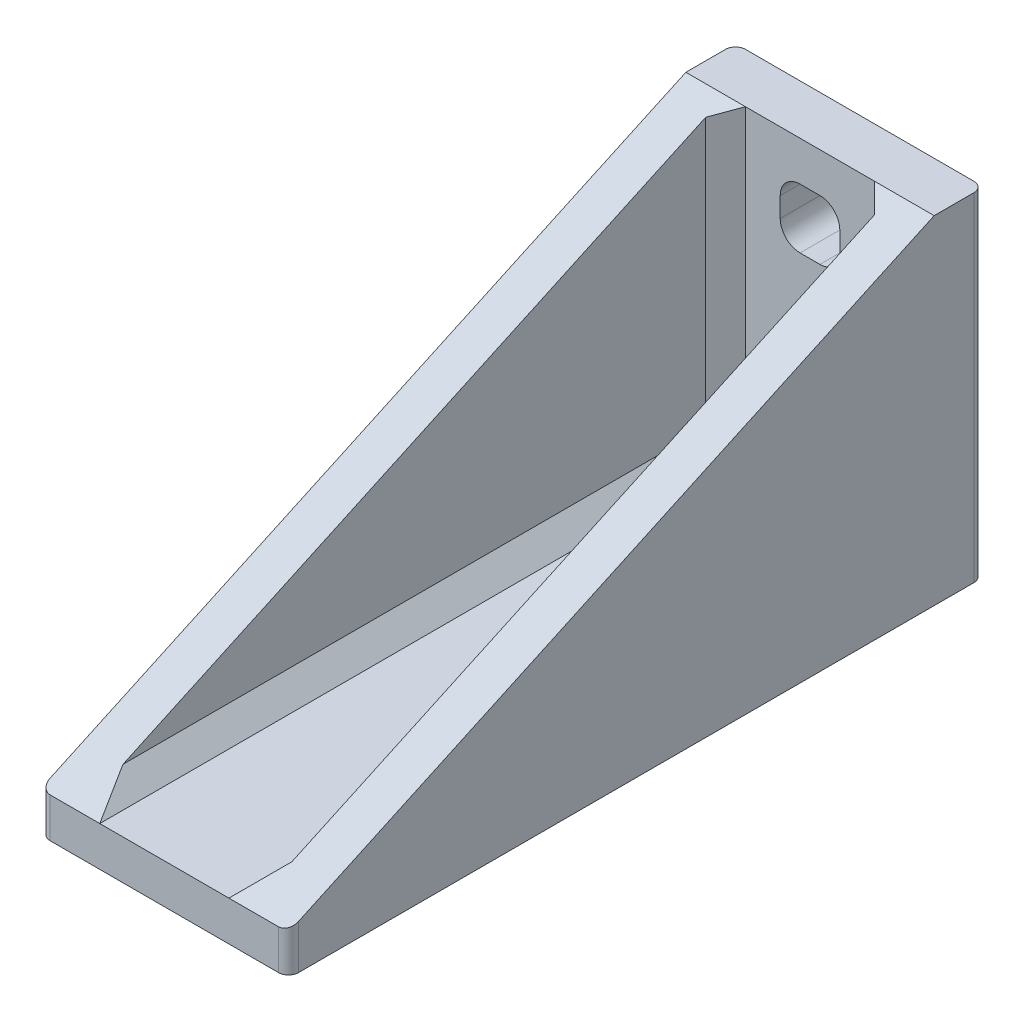
ISO-10303-21;
HEADER;
FILE_DESCRIPTION(('STEP AP214'),'2;1');
FILE_NAME('part.step','',(''),(''),'','','');
FILE_SCHEMA(('AUTOMOTIVE_DESIGN { 1 0 10303 214 1 1 1 1 }'));
ENDSEC;
DATA;
#1=APPLICATION_CONTEXT('core data for automotive mechanical design processes');
#2=APPLICATION_PROTOCOL_DEFINITION('international standard','automotive_design',2000,#1);
#3=PRODUCT_CONTEXT('',#1,'mechanical');
#4=PRODUCT('Part','Part','',(#3));
#5=PRODUCT_RELATED_PRODUCT_CATEGORY('part','',(#4));
#6=PRODUCT_DEFINITION_FORMATION('','',#4);
#7=PRODUCT_DEFINITION_CONTEXT('part definition',#1,'design');
#8=PRODUCT_DEFINITION('design','',#6,#7);
#9=PRODUCT_DEFINITION_SHAPE('','',#8);
#10=(LENGTH_UNIT() NAMED_UNIT(*) SI_UNIT(.MILLI.,.METRE.));
#11=(NAMED_UNIT(*) PLANE_ANGLE_UNIT() SI_UNIT($,.RADIAN.));
#12=(NAMED_UNIT(*) SI_UNIT($,.STERADIAN.) SOLID_ANGLE_UNIT());
#13=UNCERTAINTY_MEASURE_WITH_UNIT(LENGTH_MEASURE(1.E-05),#10,'distance_accuracy_value','');
#14=(GEOMETRIC_REPRESENTATION_CONTEXT(3) GLOBAL_UNCERTAINTY_ASSIGNED_CONTEXT((#13)) GLOBAL_UNIT_ASSIGNED_CONTEXT((#10,
#11,#12)) REPRESENTATION_CONTEXT('',''));
#15=CARTESIAN_POINT('',(0.,0.,0.));
#16=DIRECTION('',(0.,0.,1.));
#17=DIRECTION('',(1.,0.,0.));
#18=AXIS2_PLACEMENT_3D('',#15,#16,#17);
#19=CARTESIAN_POINT('',(-11.5,4.,34.));
#20=DIRECTION('',(0.,1.,0.));
#21=DIRECTION('',(0.,0.,1.));
#22=AXIS2_PLACEMENT_3D('',#19,#20,#21);
#23=CYLINDRICAL_SURFACE('',#22,1.);
#24=DIRECTION('',(0.,1.,0.));
#25=VECTOR('',#24,1.);
#26=CARTESIAN_POINT('',(-12.5,4.,34.));
#27=LINE('',#26,#25);
#28=CARTESIAN_POINT('',(-12.5,0.,34.));
#29=VERTEX_POINT('',#28);
#30=CARTESIAN_POINT('',(-12.5,4.46153846153823,34.));
#31=VERTEX_POINT('',#30);
#32=EDGE_CURVE('E496',#29,#31,#27,.T.);
#33=ORIENTED_EDGE('',*,*,#32,.F.);
#34=CARTESIAN_POINT('',(-11.5,0.,34.));
#35=DIRECTION('',(0.,1.,0.));
#36=DIRECTION('',(0.,0.,1.));
#37=AXIS2_PLACEMENT_3D('',#34,#35,#36);
#38=CIRCLE('',#37,1.);
#39=CARTESIAN_POINT('',(-11.5,0.,35.));
#40=VERTEX_POINT('',#39);
#41=EDGE_CURVE('E41',#40,#29,#38,.F.);
#42=ORIENTED_EDGE('',*,*,#41,.F.);
#43=DIRECTION('',(0.,1.,0.));
#44=VECTOR('',#43,1.);
#45=CARTESIAN_POINT('',(-11.5,4.,35.));
#46=LINE('',#45,#44);
#47=CARTESIAN_POINT('',(-11.5,4.,35.));
#48=VERTEX_POINT('',#47);
#49=EDGE_CURVE('E499',#48,#40,#46,.F.);
#50=ORIENTED_EDGE('',*,*,#49,.F.);
#51=CARTESIAN_POINT('',(-11.5,4.46153846153824,34.));
#52=DIRECTION('',(0.,-0.907959384500451,-0.419058177461749));
#53=DIRECTION('',(0.,0.419058177461749,-0.907959384500451));
#54=AXIS2_PLACEMENT_3D('',#51,#52,#53);
#55=ELLIPSE('',#54,1.10137085102126,1.);
#56=EDGE_CURVE('E11',#31,#48,#55,.F.);
#57=ORIENTED_EDGE('',*,*,#56,.F.);
#58=EDGE_LOOP('',(#33,#42,#50,#57));
#59=FACE_BOUND('',#58,.T.);
#60=ADVANCED_FACE('F34',(#59),#23,.T.);
#61=CARTESIAN_POINT('',(11.5,4.,34.));
#62=DIRECTION('',(0.,1.,0.));
#63=DIRECTION('',(0.,0.,1.));
#64=AXIS2_PLACEMENT_3D('',#61,#62,#63);
#65=CYLINDRICAL_SURFACE('',#64,1.);
#66=DIRECTION('',(0.,1.,0.));
#67=VECTOR('',#66,1.);
#68=CARTESIAN_POINT('',(11.5,4.,35.));
#69=LINE('',#68,#67);
#70=CARTESIAN_POINT('',(11.5,0.,35.));
#71=VERTEX_POINT('',#70);
#72=CARTESIAN_POINT('',(11.5,4.,35.));
#73=VERTEX_POINT('',#72);
#74=EDGE_CURVE('E485',#71,#73,#69,.T.);
#75=ORIENTED_EDGE('',*,*,#74,.F.);
#76=CARTESIAN_POINT('',(11.5,0.,34.));
#77=DIRECTION('',(0.,1.,0.));
#78=DIRECTION('',(0.,0.,1.));
#79=AXIS2_PLACEMENT_3D('',#76,#77,#78);
#80=CIRCLE('',#79,1.);
#81=CARTESIAN_POINT('',(12.5,0.,34.));
#82=VERTEX_POINT('',#81);
#83=EDGE_CURVE('E491',#82,#71,#80,.F.);
#84=ORIENTED_EDGE('',*,*,#83,.F.);
#85=DIRECTION('',(0.,1.,0.));
#86=VECTOR('',#85,1.);
#87=CARTESIAN_POINT('',(12.5,4.,34.));
#88=LINE('',#87,#86);
#89=CARTESIAN_POINT('',(12.5,4.46153846153823,34.));
#90=VERTEX_POINT('',#89);
#91=EDGE_CURVE('E488',#90,#82,#88,.F.);
#92=ORIENTED_EDGE('',*,*,#91,.F.);
#93=CARTESIAN_POINT('',(11.5,4.46153846153824,34.));
#94=DIRECTION('',(0.,-0.907959384500451,-0.419058177461749));
#95=DIRECTION('',(0.,0.419058177461749,-0.907959384500451));
#96=AXIS2_PLACEMENT_3D('',#93,#94,#95);
#97=ELLIPSE('',#96,1.10137085102126,1.);
#98=EDGE_CURVE('E494',#73,#90,#97,.F.);
#99=ORIENTED_EDGE('',*,*,#98,.F.);
#100=EDGE_LOOP('',(#75,#84,#92,#99));
#101=FACE_BOUND('',#100,.T.);
#102=ADVANCED_FACE('F533',(#101),#65,.T.);
#103=CARTESIAN_POINT('',(-11.5,4.,-34.));
#104=DIRECTION('',(0.,1.,0.));
#105=DIRECTION('',(0.,0.,1.));
#106=AXIS2_PLACEMENT_3D('',#103,#104,#105);
#107=CYLINDRICAL_SURFACE('',#106,1.);
#108=DIRECTION('',(0.,1.,0.));
#109=VECTOR('',#108,1.);
#110=CARTESIAN_POINT('',(-11.5,4.,-35.));
#111=LINE('',#110,#109);
#112=CARTESIAN_POINT('',(-11.5,0.,-35.));
#113=VERTEX_POINT('',#112);
#114=CARTESIAN_POINT('',(-11.5,34.,-35.));
#115=VERTEX_POINT('',#114);
#116=EDGE_CURVE('E475',#113,#115,#111,.T.);
#117=ORIENTED_EDGE('',*,*,#116,.F.);
#118=CARTESIAN_POINT('',(-11.5,0.,-34.));
#119=DIRECTION('',(0.,1.,0.));
#120=DIRECTION('',(0.,0.,1.));
#121=AXIS2_PLACEMENT_3D('',#118,#119,#120);
#122=CIRCLE('',#121,1.);
#123=CARTESIAN_POINT('',(-12.5,0.,-34.));
#124=VERTEX_POINT('',#123);
#125=EDGE_CURVE('E481',#124,#113,#122,.F.);
#126=ORIENTED_EDGE('',*,*,#125,.F.);
#127=DIRECTION('',(0.,1.,0.));
#128=VECTOR('',#127,1.);
#129=CARTESIAN_POINT('',(-12.5,4.,-34.));
#130=LINE('',#129,#128);
#131=CARTESIAN_POINT('',(-12.5,34.,-34.));
#132=VERTEX_POINT('',#131);
#133=EDGE_CURVE('E478',#132,#124,#130,.F.);
#134=ORIENTED_EDGE('',*,*,#133,.F.);
#135=CARTESIAN_POINT('',(-11.5,34.,-34.));
#136=DIRECTION('',(0.,1.,0.));
#137=DIRECTION('',(0.,0.,1.));
#138=AXIS2_PLACEMENT_3D('',#135,#136,#137);
#139=CIRCLE('',#138,1.);
#140=EDGE_CURVE('E483',#115,#132,#139,.T.);
#141=ORIENTED_EDGE('',*,*,#140,.F.);
#142=EDGE_LOOP('',(#117,#126,#134,#141));
#143=FACE_BOUND('',#142,.T.);
#144=ADVANCED_FACE('F510',(#143),#107,.T.);
#145=CARTESIAN_POINT('',(11.5,4.,-34.));
#146=DIRECTION('',(0.,-1.,0.));
#147=DIRECTION('',(0.,0.,-1.));
#148=AXIS2_PLACEMENT_3D('',#145,#146,#147);
#149=CYLINDRICAL_SURFACE('',#148,1.);
#150=DIRECTION('',(0.,-1.,0.));
#151=VECTOR('',#150,1.);
#152=CARTESIAN_POINT('',(11.5,4.,-35.));
#153=LINE('',#152,#151);
#154=CARTESIAN_POINT('',(11.5,34.,-35.));
#155=VERTEX_POINT('',#154);
#156=CARTESIAN_POINT('',(11.5,0.,-35.));
#157=VERTEX_POINT('',#156);
#158=EDGE_CURVE('E464',#155,#157,#153,.T.);
#159=ORIENTED_EDGE('',*,*,#158,.F.);
#160=CARTESIAN_POINT('',(11.5,34.,-34.));
#161=DIRECTION('',(0.,1.,0.));
#162=DIRECTION('',(0.,0.,1.));
#163=AXIS2_PLACEMENT_3D('',#160,#161,#162);
#164=CIRCLE('',#163,1.);
#165=CARTESIAN_POINT('',(12.5,34.,-34.));
#166=VERTEX_POINT('',#165);
#167=EDGE_CURVE('E470',#166,#155,#164,.T.);
#168=ORIENTED_EDGE('',*,*,#167,.F.);
#169=DIRECTION('',(0.,-1.,0.));
#170=VECTOR('',#169,1.);
#171=CARTESIAN_POINT('',(12.5,4.,-34.));
#172=LINE('',#171,#170);
#173=CARTESIAN_POINT('',(12.5,0.,-34.));
#174=VERTEX_POINT('',#173);
#175=EDGE_CURVE('E467',#174,#166,#172,.F.);
#176=ORIENTED_EDGE('',*,*,#175,.F.);
#177=CARTESIAN_POINT('',(11.5,0.,-34.));
#178=DIRECTION('',(0.,1.,0.));
#179=DIRECTION('',(0.,0.,1.));
#180=AXIS2_PLACEMENT_3D('',#177,#178,#179);
#181=CIRCLE('',#180,1.);
#182=EDGE_CURVE('E472',#157,#174,#181,.F.);
#183=ORIENTED_EDGE('',*,*,#182,.F.);
#184=EDGE_LOOP('',(#159,#168,#176,#183));
#185=FACE_BOUND('',#184,.T.);
#186=ADVANCED_FACE('F518',(#185),#149,.T.);
#187=CARTESIAN_POINT('',(-12.5,34.,-30.));
#188=DIRECTION('',(0.,-0.907959384500451,-0.419058177461749));
#189=DIRECTION('',(1.,0.,0.));
#190=AXIS2_PLACEMENT_3D('',#187,#188,#189);
#191=PLANE('',#190);
#192=DIRECTION('',(1.,0.,0.));
#193=VECTOR('',#192,1.);
#194=CARTESIAN_POINT('',(-12.5,4.,35.));
#195=LINE('',#194,#193);
#196=CARTESIAN_POINT('',(6.50000000000001,4.,35.));
#197=VERTEX_POINT('',#196);
#198=EDGE_CURVE('E363',#197,#73,#195,.T.);
#199=ORIENTED_EDGE('',*,*,#198,.T.);
#200=ORIENTED_EDGE('',*,*,#98,.T.);
#201=DIRECTION('',(0.,-0.419058177461749,0.907959384500451));
#202=VECTOR('',#201,1.);
#203=CARTESIAN_POINT('',(12.5,30.6341463414633,-22.7073170731707));
#204=LINE('',#203,#202);
#205=CARTESIAN_POINT('',(12.5,34.,-30.));
#206=VERTEX_POINT('',#205);
#207=EDGE_CURVE('E362',#206,#90,#204,.T.);
#208=ORIENTED_EDGE('',*,*,#207,.F.);
#209=DIRECTION('',(1.,0.,0.));
#210=VECTOR('',#209,1.);
#211=CARTESIAN_POINT('',(-12.5,34.,-30.));
#212=LINE('',#211,#210);
#213=CARTESIAN_POINT('',(6.49999999999998,34.,-30.));
#214=VERTEX_POINT('',#213);
#215=EDGE_CURVE('E349',#214,#206,#212,.T.);
#216=ORIENTED_EDGE('',*,*,#215,.F.);
#217=DIRECTION('',(0.672213996993528,-0.310252613997012,0.672213996993522));
#218=VECTOR('',#217,1.);
#219=CARTESIAN_POINT('',(-2.0855614973263,37.9625668449197,-38.5855614973262));
#220=LINE('',#219,#218);
#221=CARTESIAN_POINT('',(8.50000000000001,33.076923076923,-28.));
#222=VERTEX_POINT('',#221);
#223=EDGE_CURVE('E430',#214,#222,#220,.T.);
#224=ORIENTED_EDGE('',*,*,#223,.T.);
#225=DIRECTION('',(0.,-0.419058177461749,0.907959384500451));
#226=VECTOR('',#225,1.);
#227=CARTESIAN_POINT('',(8.50000000000001,34.,-30.));
#228=LINE('',#227,#226);
#229=CARTESIAN_POINT('',(8.50000000000001,6.00000000000001,30.6666666666662));
#230=VERTEX_POINT('',#229);
#231=EDGE_CURVE('E380',#222,#230,#228,.T.);
#232=ORIENTED_EDGE('',*,*,#231,.T.);
#233=DIRECTION('',(0.386493975840497,0.386493975840501,-0.83740361432108));
#234=VECTOR('',#233,1.);
#235=CARTESIAN_POINT('',(29.180497925311,26.6804979253112,-14.1410788381745));
#236=LINE('',#235,#234);
#237=EDGE_CURVE('E396',#230,#197,#236,.F.);
#238=ORIENTED_EDGE('',*,*,#237,.T.);
#239=EDGE_LOOP('',(#199,#200,#208,#216,#224,#232,#238));
#240=FACE_BOUND('',#239,.T.);
#241=ADVANCED_FACE('F529',(#240),#191,.F.);
#242=CARTESIAN_POINT('',(12.5,4.,-35.));
#243=DIRECTION('',(-1.,0.,0.));
#244=DIRECTION('',(0.,0.,1.));
#245=AXIS2_PLACEMENT_3D('',#242,#243,#244);
#246=PLANE('',#245);
#247=ORIENTED_EDGE('',*,*,#207,.T.);
#248=ORIENTED_EDGE('',*,*,#91,.T.);
#249=DIRECTION('',(0.,0.,-1.));
#250=VECTOR('',#249,1.);
#251=CARTESIAN_POINT('',(12.5,0.,-35.));
#252=LINE('',#251,#250);
#253=EDGE_CURVE('E359',#82,#174,#252,.T.);
#254=ORIENTED_EDGE('',*,*,#253,.T.);
#255=ORIENTED_EDGE('',*,*,#175,.T.);
#256=DIRECTION('',(0.,0.,-1.));
#257=VECTOR('',#256,1.);
#258=CARTESIAN_POINT('',(12.5,34.,-35.));
#259=LINE('',#258,#257);
#260=EDGE_CURVE('E353',#206,#166,#259,.T.);
#261=ORIENTED_EDGE('',*,*,#260,.F.);
#262=EDGE_LOOP('',(#247,#248,#254,#255,#261));
#263=FACE_BOUND('',#262,.T.);
#264=ADVANCED_FACE('F521',(#263),#246,.F.);
#265=CARTESIAN_POINT('',(-12.5,4.,-35.));
#266=DIRECTION('',(0.,0.,1.));
#267=DIRECTION('',(1.,0.,0.));
#268=AXIS2_PLACEMENT_3D('',#265,#266,#267);
#269=PLANE('',#268);
#270=DIRECTION('',(-1.,0.,0.));
#271=VECTOR('',#270,1.);
#272=CARTESIAN_POINT('',(0.999999999999995,24.,-35.));
#273=LINE('',#272,#271);
#274=CARTESIAN_POINT('',(0.999999999999996,24.,-35.));
#275=VERTEX_POINT('',#274);
#276=CARTESIAN_POINT('',(-1.00000000000001,24.,-35.));
#277=VERTEX_POINT('',#276);
#278=EDGE_CURVE('E261',#275,#277,#273,.T.);
#279=ORIENTED_EDGE('',*,*,#278,.F.);
#280=CARTESIAN_POINT('',(0.999999999999995,26.,-35.));
#281=DIRECTION('',(0.,0.,-1.));
#282=DIRECTION('',(1.,0.,0.));
#283=AXIS2_PLACEMENT_3D('',#280,#281,#282);
#284=CIRCLE('',#283,2.);
#285=CARTESIAN_POINT('',(2.99999999999999,26.,-35.));
#286=VERTEX_POINT('',#285);
#287=EDGE_CURVE('E266',#286,#275,#284,.T.);
#288=ORIENTED_EDGE('',*,*,#287,.F.);
#289=DIRECTION('',(0.,-1.,0.));
#290=VECTOR('',#289,1.);
#291=CARTESIAN_POINT('',(2.99999999999999,26.,-35.));
#292=LINE('',#291,#290);
#293=CARTESIAN_POINT('',(3.,28.,-35.));
#294=VERTEX_POINT('',#293);
#295=EDGE_CURVE('E286',#294,#286,#292,.T.);
#296=ORIENTED_EDGE('',*,*,#295,.F.);
#297=CARTESIAN_POINT('',(0.999999999999995,28.,-35.));
#298=DIRECTION('',(0.,0.,-1.));
#299=DIRECTION('',(-1.,0.,0.));
#300=AXIS2_PLACEMENT_3D('',#297,#298,#299);
#301=CIRCLE('',#300,2.);
#302=CARTESIAN_POINT('',(0.999999999999995,30.,-35.));
#303=VERTEX_POINT('',#302);
#304=EDGE_CURVE('E283',#303,#294,#301,.T.);
#305=ORIENTED_EDGE('',*,*,#304,.F.);
#306=DIRECTION('',(1.,0.,0.));
#307=VECTOR('',#306,1.);
#308=CARTESIAN_POINT('',(0.999999999999995,30.,-35.));
#309=LINE('',#308,#307);
#310=CARTESIAN_POINT('',(-1.00000000000001,30.,-35.));
#311=VERTEX_POINT('',#310);
#312=EDGE_CURVE('E280',#311,#303,#309,.T.);
#313=ORIENTED_EDGE('',*,*,#312,.F.);
#314=CARTESIAN_POINT('',(-1.00000000000001,28.,-35.));
#315=DIRECTION('',(0.,0.,-1.));
#316=DIRECTION('',(1.,0.,0.));
#317=AXIS2_PLACEMENT_3D('',#314,#315,#316);
#318=CIRCLE('',#317,2.);
#319=CARTESIAN_POINT('',(-3.,28.,-35.));
#320=VERTEX_POINT('',#319);
#321=EDGE_CURVE('E274',#320,#311,#318,.T.);
#322=ORIENTED_EDGE('',*,*,#321,.F.);
#323=DIRECTION('',(0.,1.,0.));
#324=VECTOR('',#323,1.);
#325=CARTESIAN_POINT('',(-3.00000000000001,26.,-35.));
#326=LINE('',#325,#324);
#327=CARTESIAN_POINT('',(-3.00000000000001,26.,-35.));
#328=VERTEX_POINT('',#327);
#329=EDGE_CURVE('E272',#328,#320,#326,.T.);
#330=ORIENTED_EDGE('',*,*,#329,.F.);
#331=CARTESIAN_POINT('',(-1.,26.,-35.));
#332=DIRECTION('',(0.,0.,-1.));
#333=DIRECTION('',(1.,0.,0.));
#334=AXIS2_PLACEMENT_3D('',#331,#332,#333);
#335=CIRCLE('',#334,2.);
#336=EDGE_CURVE('E250',#277,#328,#335,.T.);
#337=ORIENTED_EDGE('',*,*,#336,.F.);
#338=EDGE_LOOP('',(#279,#288,#296,#305,#313,#322,#330,#337));
#339=FACE_BOUND('',#338,.T.);
#340=DIRECTION('',(-1.,0.,0.));
#341=VECTOR('',#340,1.);
#342=CARTESIAN_POINT('',(0.999999999999995,10.,-35.));
#343=LINE('',#342,#341);
#344=CARTESIAN_POINT('',(0.999999999999996,10.,-35.));
#345=VERTEX_POINT('',#344);
#346=CARTESIAN_POINT('',(-1.00000000000001,10.,-35.));
#347=VERTEX_POINT('',#346);
#348=EDGE_CURVE('E303',#345,#347,#343,.T.);
#349=ORIENTED_EDGE('',*,*,#348,.F.);
#350=CARTESIAN_POINT('',(0.999999999999995,12.,-35.));
#351=DIRECTION('',(0.,0.,-1.));
#352=DIRECTION('',(1.,0.,0.));
#353=AXIS2_PLACEMENT_3D('',#350,#351,#352);
#354=CIRCLE('',#353,2.);
#355=CARTESIAN_POINT('',(3.,12.,-35.));
#356=VERTEX_POINT('',#355);
#357=EDGE_CURVE('E291',#356,#345,#354,.T.);
#358=ORIENTED_EDGE('',*,*,#357,.F.);
#359=DIRECTION('',(0.,-1.,0.));
#360=VECTOR('',#359,1.);
#361=CARTESIAN_POINT('',(2.99999999999999,14.,-35.));
#362=LINE('',#361,#360);
#363=CARTESIAN_POINT('',(3.,14.,-35.));
#364=VERTEX_POINT('',#363);
#365=EDGE_CURVE('E321',#364,#356,#362,.T.);
#366=ORIENTED_EDGE('',*,*,#365,.F.);
#367=CARTESIAN_POINT('',(0.999999999999995,14.,-35.));
#368=DIRECTION('',(0.,0.,-1.));
#369=DIRECTION('',(-1.,0.,0.));
#370=AXIS2_PLACEMENT_3D('',#367,#368,#369);
#371=CIRCLE('',#370,2.);
#372=CARTESIAN_POINT('',(0.999999999999995,16.,-35.));
#373=VERTEX_POINT('',#372);
#374=EDGE_CURVE('E318',#373,#364,#371,.T.);
#375=ORIENTED_EDGE('',*,*,#374,.F.);
#376=DIRECTION('',(1.,0.,0.));
#377=VECTOR('',#376,1.);
#378=CARTESIAN_POINT('',(0.999999999999995,16.,-35.));
#379=LINE('',#378,#377);
#380=CARTESIAN_POINT('',(-1.00000000000001,16.,-35.));
#381=VERTEX_POINT('',#380);
#382=EDGE_CURVE('E315',#381,#373,#379,.T.);
#383=ORIENTED_EDGE('',*,*,#382,.F.);
#384=CARTESIAN_POINT('',(-1.,14.,-35.));
#385=DIRECTION('',(0.,0.,-1.));
#386=DIRECTION('',(-1.,0.,0.));
#387=AXIS2_PLACEMENT_3D('',#384,#385,#386);
#388=CIRCLE('',#387,2.);
#389=CARTESIAN_POINT('',(-3.00000000000001,14.,-35.));
#390=VERTEX_POINT('',#389);
#391=EDGE_CURVE('E312',#390,#381,#388,.T.);
#392=ORIENTED_EDGE('',*,*,#391,.F.);
#393=DIRECTION('',(0.,1.,0.));
#394=VECTOR('',#393,1.);
#395=CARTESIAN_POINT('',(-3.00000000000001,14.,-35.));
#396=LINE('',#395,#394);
#397=CARTESIAN_POINT('',(-3.,12.,-35.));
#398=VERTEX_POINT('',#397);
#399=EDGE_CURVE('E309',#398,#390,#396,.T.);
#400=ORIENTED_EDGE('',*,*,#399,.F.);
#401=CARTESIAN_POINT('',(-1.00000000000001,12.,-35.));
#402=DIRECTION('',(0.,0.,-1.));
#403=DIRECTION('',(-1.,0.,0.));
#404=AXIS2_PLACEMENT_3D('',#401,#402,#403);
#405=CIRCLE('',#404,2.);
#406=EDGE_CURVE('E306',#347,#398,#405,.T.);
#407=ORIENTED_EDGE('',*,*,#406,.F.);
#408=EDGE_LOOP('',(#349,#358,#366,#375,#383,#392,#400,#407));
#409=FACE_BOUND('',#408,.T.);
#410=DIRECTION('',(-1.,0.,0.));
#411=VECTOR('',#410,1.);
#412=CARTESIAN_POINT('',(-12.5,0.,-35.));
#413=LINE('',#412,#411);
#414=EDGE_CURVE('E365',#157,#113,#413,.T.);
#415=ORIENTED_EDGE('',*,*,#414,.T.);
#416=ORIENTED_EDGE('',*,*,#116,.T.);
#417=DIRECTION('',(-1.,0.,0.));
#418=VECTOR('',#417,1.);
#419=CARTESIAN_POINT('',(-12.5,34.,-35.));
#420=LINE('',#419,#418);
#421=EDGE_CURVE('E356',#155,#115,#420,.T.);
#422=ORIENTED_EDGE('',*,*,#421,.F.);
#423=ORIENTED_EDGE('',*,*,#158,.T.);
#424=EDGE_LOOP('',(#415,#416,#422,#423));
#425=FACE_BOUND('',#424,.T.);
#426=ADVANCED_FACE('F268',(#339,#409,#425),#269,.F.);
#427=CARTESIAN_POINT('',(-12.5,4.,-35.));
#428=DIRECTION('',(1.,0.,0.));
#429=DIRECTION('',(0.,0.,-1.));
#430=AXIS2_PLACEMENT_3D('',#427,#428,#429);
#431=PLANE('',#430);
#432=DIRECTION('',(0.,0.,1.));
#433=VECTOR('',#432,1.);
#434=CARTESIAN_POINT('',(-12.5,0.,-35.));
#435=LINE('',#434,#433);
#436=EDGE_CURVE('E368',#124,#29,#435,.T.);
#437=ORIENTED_EDGE('',*,*,#436,.T.);
#438=ORIENTED_EDGE('',*,*,#32,.T.);
#439=DIRECTION('',(0.,0.419058177461749,-0.907959384500451));
#440=VECTOR('',#439,1.);
#441=CARTESIAN_POINT('',(-12.5,30.6341463414633,-22.7073170731707));
#442=LINE('',#441,#440);
#443=CARTESIAN_POINT('',(-12.5,34.,-30.));
#444=VERTEX_POINT('',#443);
#445=EDGE_CURVE('E375',#31,#444,#442,.T.);
#446=ORIENTED_EDGE('',*,*,#445,.T.);
#447=DIRECTION('',(0.,0.,1.));
#448=VECTOR('',#447,1.);
#449=CARTESIAN_POINT('',(-12.5,34.,-35.));
#450=LINE('',#449,#448);
#451=EDGE_CURVE('E344',#132,#444,#450,.T.);
#452=ORIENTED_EDGE('',*,*,#451,.F.);
#453=ORIENTED_EDGE('',*,*,#133,.T.);
#454=EDGE_LOOP('',(#437,#438,#446,#452,#453));
#455=FACE_BOUND('',#454,.T.);
#456=ADVANCED_FACE('F505',(#455),#431,.F.);
#457=CARTESIAN_POINT('',(-12.5,4.,35.));
#458=DIRECTION('',(0.,0.,-1.));
#459=DIRECTION('',(-1.,0.,0.));
#460=AXIS2_PLACEMENT_3D('',#457,#458,#459);
#461=PLANE('',#460);
#462=CARTESIAN_POINT('',(-6.49999999999999,4.,35.));
#463=VERTEX_POINT('',#462);
#464=EDGE_CURVE('E360',#48,#463,#195,.T.);
#465=ORIENTED_EDGE('',*,*,#464,.F.);
#466=ORIENTED_EDGE('',*,*,#49,.T.);
#467=DIRECTION('',(1.,0.,0.));
#468=VECTOR('',#467,1.);
#469=CARTESIAN_POINT('',(-12.5,0.,35.));
#470=LINE('',#469,#468);
#471=EDGE_CURVE('E371',#40,#71,#470,.T.);
#472=ORIENTED_EDGE('',*,*,#471,.T.);
#473=ORIENTED_EDGE('',*,*,#74,.T.);
#474=ORIENTED_EDGE('',*,*,#198,.F.);
#475=DIRECTION('',(1.,0.,0.));
#476=VECTOR('',#475,1.);
#477=CARTESIAN_POINT('',(-8.49999999999999,4.,35.));
#478=LINE('',#477,#476);
#479=EDGE_CURVE('E327',#463,#197,#478,.T.);
#480=ORIENTED_EDGE('',*,*,#479,.F.);
#481=EDGE_LOOP('',(#465,#466,#472,#473,#474,#480));
#482=FACE_BOUND('',#481,.T.);
#483=ADVANCED_FACE('F536',(#482),#461,.F.);
#484=CARTESIAN_POINT('',(0.,0.,0.));
#485=DIRECTION('',(0.,1.,0.));
#486=DIRECTION('',(0.,0.,1.));
#487=AXIS2_PLACEMENT_3D('',#484,#485,#486);
#488=PLANE('',#487);
#489=ORIENTED_EDGE('',*,*,#471,.F.);
#490=ORIENTED_EDGE('',*,*,#41,.T.);
#491=ORIENTED_EDGE('',*,*,#436,.F.);
#492=ORIENTED_EDGE('',*,*,#125,.T.);
#493=ORIENTED_EDGE('',*,*,#414,.F.);
#494=ORIENTED_EDGE('',*,*,#182,.T.);
#495=ORIENTED_EDGE('',*,*,#253,.F.);
#496=ORIENTED_EDGE('',*,*,#83,.T.);
#497=EDGE_LOOP('',(#489,#490,#491,#492,#493,#494,#495,#496));
#498=FACE_BOUND('',#497,.T.);
#499=ADVANCED_FACE('F503',(#498),#488,.F.);
#500=CARTESIAN_POINT('',(0.,34.,0.));
#501=DIRECTION('',(0.,1.,0.));
#502=DIRECTION('',(0.,0.,1.));
#503=AXIS2_PLACEMENT_3D('',#500,#501,#502);
#504=PLANE('',#503);
#505=ORIENTED_EDGE('',*,*,#421,.T.);
#506=ORIENTED_EDGE('',*,*,#140,.T.);
#507=ORIENTED_EDGE('',*,*,#451,.T.);
#508=CARTESIAN_POINT('',(-6.49999999999997,34.,-30.));
#509=VERTEX_POINT('',#508);
#510=EDGE_CURVE('E350',#444,#509,#212,.T.);
#511=ORIENTED_EDGE('',*,*,#510,.T.);
#512=DIRECTION('',(-1.,0.,0.));
#513=VECTOR('',#512,1.);
#514=CARTESIAN_POINT('',(-8.49999999999999,34.,-30.));
#515=LINE('',#514,#513);
#516=EDGE_CURVE('E342',#214,#509,#515,.T.);
#517=ORIENTED_EDGE('',*,*,#516,.F.);
#518=ORIENTED_EDGE('',*,*,#215,.T.);
#519=ORIENTED_EDGE('',*,*,#260,.T.);
#520=ORIENTED_EDGE('',*,*,#167,.T.);
#521=EDGE_LOOP('',(#505,#506,#507,#511,#517,#518,#519,#520));
#522=FACE_BOUND('',#521,.T.);
#523=ADVANCED_FACE('F523',(#522),#504,.T.);
#524=ORIENTED_EDGE('',*,*,#445,.F.);
#525=ORIENTED_EDGE('',*,*,#56,.T.);
#526=ORIENTED_EDGE('',*,*,#464,.T.);
#527=DIRECTION('',(0.386493975840502,-0.3864939758405,0.837403614321078));
#528=VECTOR('',#527,1.);
#529=CARTESIAN_POINT('',(-32.9149377593361,30.414937759336,-22.2323651452281));
#530=LINE('',#529,#528);
#531=CARTESIAN_POINT('',(-8.49999999999999,5.99999999999998,30.6666666666662));
#532=VERTEX_POINT('',#531);
#533=EDGE_CURVE('E388',#463,#532,#530,.F.);
#534=ORIENTED_EDGE('',*,*,#533,.T.);
#535=DIRECTION('',(0.,0.419058177461749,-0.907959384500451));
#536=VECTOR('',#535,1.);
#537=CARTESIAN_POINT('',(-8.49999999999999,34.,-30.));
#538=LINE('',#537,#536);
#539=CARTESIAN_POINT('',(-8.49999999999999,33.076923076923,-28.));
#540=VERTEX_POINT('',#539);
#541=EDGE_CURVE('E377',#532,#540,#538,.T.);
#542=ORIENTED_EDGE('',*,*,#541,.T.);
#543=DIRECTION('',(0.672213996993528,0.310252613997012,-0.672213996993522));
#544=VECTOR('',#543,1.);
#545=CARTESIAN_POINT('',(-9.21122994652408,32.7486631016042,-27.2887700534759));
#546=LINE('',#545,#544);
#547=EDGE_CURVE('E418',#540,#509,#546,.T.);
#548=ORIENTED_EDGE('',*,*,#547,.T.);
#549=ORIENTED_EDGE('',*,*,#510,.F.);
#550=EDGE_LOOP('',(#524,#525,#526,#534,#542,#548,#549));
#551=FACE_BOUND('',#550,.T.);
#552=ADVANCED_FACE('F567',(#551),#191,.F.);
#553=CARTESIAN_POINT('',(8.50000000000001,34.,-30.));
#554=DIRECTION('',(1.,0.,0.));
#555=DIRECTION('',(0.,1.,0.));
#556=AXIS2_PLACEMENT_3D('',#553,#554,#555);
#557=PLANE('',#556);
#558=ORIENTED_EDGE('',*,*,#231,.F.);
#559=DIRECTION('',(0.,-1.,0.));
#560=VECTOR('',#559,1.);
#561=CARTESIAN_POINT('',(8.50000000000001,34.,-28.));
#562=LINE('',#561,#560);
#563=CARTESIAN_POINT('',(8.50000000000001,6.00000000000002,-28.));
#564=VERTEX_POINT('',#563);
#565=EDGE_CURVE('E424',#222,#564,#562,.T.);
#566=ORIENTED_EDGE('',*,*,#565,.T.);
#567=DIRECTION('',(0.,0.,1.));
#568=VECTOR('',#567,1.);
#569=CARTESIAN_POINT('',(8.50000000000001,6.00000000000002,35.));
#570=LINE('',#569,#568);
#571=EDGE_CURVE('E390',#564,#230,#570,.T.);
#572=ORIENTED_EDGE('',*,*,#571,.T.);
#573=EDGE_LOOP('',(#558,#566,#572));
#574=FACE_BOUND('',#573,.T.);
#575=ADVANCED_FACE('F577',(#574),#557,.F.);
#576=CARTESIAN_POINT('',(-8.49999999999999,34.,-30.));
#577=DIRECTION('',(-1.,0.,0.));
#578=DIRECTION('',(0.,-1.,0.));
#579=AXIS2_PLACEMENT_3D('',#576,#577,#578);
#580=PLANE('',#579);
#581=DIRECTION('',(0.,0.,-1.));
#582=VECTOR('',#581,1.);
#583=CARTESIAN_POINT('',(-8.49999999999999,5.99999999999999,-30.));
#584=LINE('',#583,#582);
#585=CARTESIAN_POINT('',(-8.49999999999999,5.99999999999999,-28.));
#586=VERTEX_POINT('',#585);
#587=EDGE_CURVE('E385',#532,#586,#584,.T.);
#588=ORIENTED_EDGE('',*,*,#587,.T.);
#589=DIRECTION('',(0.,1.,0.));
#590=VECTOR('',#589,1.);
#591=CARTESIAN_POINT('',(-8.49999999999999,34.,-28.));
#592=LINE('',#591,#590);
#593=EDGE_CURVE('E416',#586,#540,#592,.T.);
#594=ORIENTED_EDGE('',*,*,#593,.T.);
#595=ORIENTED_EDGE('',*,*,#541,.F.);
#596=EDGE_LOOP('',(#588,#594,#595));
#597=FACE_BOUND('',#596,.T.);
#598=ADVANCED_FACE('F566',(#597),#580,.F.);
#599=CARTESIAN_POINT('',(-8.49999999999999,4.,-30.));
#600=DIRECTION('',(0.,-1.,0.));
#601=DIRECTION('',(0.,0.,-1.));
#602=AXIS2_PLACEMENT_3D('',#599,#600,#601);
#603=PLANE('',#602);
#604=DIRECTION('',(0.,0.,-1.));
#605=VECTOR('',#604,1.);
#606=CARTESIAN_POINT('',(6.50000000000001,4.,-30.));
#607=LINE('',#606,#605);
#608=CARTESIAN_POINT('',(6.50000000000001,4.,-28.));
#609=VERTEX_POINT('',#608);
#610=EDGE_CURVE('E393',#197,#609,#607,.T.);
#611=ORIENTED_EDGE('',*,*,#610,.T.);
#612=DIRECTION('',(-1.,0.,0.));
#613=VECTOR('',#612,1.);
#614=CARTESIAN_POINT('',(-8.49999999999999,4.,-28.));
#615=LINE('',#614,#613);
#616=CARTESIAN_POINT('',(-6.49999999999999,4.,-28.));
#617=VERTEX_POINT('',#616);
#618=EDGE_CURVE('E404',#609,#617,#615,.T.);
#619=ORIENTED_EDGE('',*,*,#618,.T.);
#620=DIRECTION('',(0.,0.,1.));
#621=VECTOR('',#620,1.);
#622=CARTESIAN_POINT('',(-6.49999999999999,4.,35.));
#623=LINE('',#622,#621);
#624=EDGE_CURVE('E382',#617,#463,#623,.T.);
#625=ORIENTED_EDGE('',*,*,#624,.T.);
#626=ORIENTED_EDGE('',*,*,#479,.T.);
#627=EDGE_LOOP('',(#611,#619,#625,#626));
#628=FACE_BOUND('',#627,.T.);
#629=ADVANCED_FACE('F547',(#628),#603,.F.);
#630=CARTESIAN_POINT('',(0.,0.,-30.));
#631=DIRECTION('',(0.,0.,1.));
#632=DIRECTION('',(1.,0.,0.));
#633=AXIS2_PLACEMENT_3D('',#630,#631,#632);
#634=PLANE('',#633);
#635=CARTESIAN_POINT('',(0.999999999999995,26.,-30.));
#636=DIRECTION('',(0.,0.,1.));
#637=DIRECTION('',(1.,0.,0.));
#638=AXIS2_PLACEMENT_3D('',#635,#636,#637);
#639=CIRCLE('',#638,2.);
#640=CARTESIAN_POINT('',(0.999999999999995,24.,-30.));
#641=VERTEX_POINT('',#640);
#642=CARTESIAN_POINT('',(2.99999999999999,26.,-30.));
#643=VERTEX_POINT('',#642);
#644=EDGE_CURVE('E462',#641,#643,#639,.T.);
#645=ORIENTED_EDGE('',*,*,#644,.F.);
#646=DIRECTION('',(1.,0.,0.));
#647=VECTOR('',#646,1.);
#648=CARTESIAN_POINT('',(0.,24.,-30.));
#649=LINE('',#648,#647);
#650=CARTESIAN_POINT('',(-1.00000000000001,24.,-30.));
#651=VERTEX_POINT('',#650);
#652=EDGE_CURVE('E449',#651,#641,#649,.T.);
#653=ORIENTED_EDGE('',*,*,#652,.F.);
#654=CARTESIAN_POINT('',(-1.,26.,-30.));
#655=DIRECTION('',(0.,0.,1.));
#656=DIRECTION('',(1.,0.,0.));
#657=AXIS2_PLACEMENT_3D('',#654,#655,#656);
#658=CIRCLE('',#657,2.);
#659=CARTESIAN_POINT('',(-3.00000000000001,26.,-30.));
#660=VERTEX_POINT('',#659);
#661=EDGE_CURVE('E253',#660,#651,#658,.T.);
#662=ORIENTED_EDGE('',*,*,#661,.F.);
#663=DIRECTION('',(0.,-1.,0.));
#664=VECTOR('',#663,1.);
#665=CARTESIAN_POINT('',(-3.00000000000002,0.,-30.));
#666=LINE('',#665,#664);
#667=CARTESIAN_POINT('',(-3.,28.,-30.));
#668=VERTEX_POINT('',#667);
#669=EDGE_CURVE('E452',#668,#660,#666,.T.);
#670=ORIENTED_EDGE('',*,*,#669,.F.);
#671=CARTESIAN_POINT('',(-1.00000000000001,28.,-30.));
#672=DIRECTION('',(0.,0.,1.));
#673=DIRECTION('',(1.,0.,0.));
#674=AXIS2_PLACEMENT_3D('',#671,#672,#673);
#675=CIRCLE('',#674,2.);
#676=CARTESIAN_POINT('',(-1.00000000000001,30.,-30.));
#677=VERTEX_POINT('',#676);
#678=EDGE_CURVE('E454',#677,#668,#675,.T.);
#679=ORIENTED_EDGE('',*,*,#678,.F.);
#680=DIRECTION('',(-1.,0.,0.));
#681=VECTOR('',#680,1.);
#682=CARTESIAN_POINT('',(0.,30.,-30.));
#683=LINE('',#682,#681);
#684=CARTESIAN_POINT('',(0.999999999999995,30.,-30.));
#685=VERTEX_POINT('',#684);
#686=EDGE_CURVE('E456',#685,#677,#683,.T.);
#687=ORIENTED_EDGE('',*,*,#686,.F.);
#688=CARTESIAN_POINT('',(0.999999999999995,28.,-30.));
#689=DIRECTION('',(0.,0.,1.));
#690=DIRECTION('',(1.,0.,0.));
#691=AXIS2_PLACEMENT_3D('',#688,#689,#690);
#692=CIRCLE('',#691,2.);
#693=CARTESIAN_POINT('',(3.,28.,-30.));
#694=VERTEX_POINT('',#693);
#695=EDGE_CURVE('E458',#694,#685,#692,.T.);
#696=ORIENTED_EDGE('',*,*,#695,.F.);
#697=DIRECTION('',(0.,1.,0.));
#698=VECTOR('',#697,1.);
#699=CARTESIAN_POINT('',(2.99999999999998,0.,-30.));
#700=LINE('',#699,#698);
#701=EDGE_CURVE('E460',#643,#694,#700,.T.);
#702=ORIENTED_EDGE('',*,*,#701,.F.);
#703=EDGE_LOOP('',(#645,#653,#662,#670,#679,#687,#696,#702));
#704=FACE_BOUND('',#703,.T.);
#705=CARTESIAN_POINT('',(0.999999999999995,12.,-30.));
#706=DIRECTION('',(0.,0.,1.));
#707=DIRECTION('',(1.,0.,0.));
#708=AXIS2_PLACEMENT_3D('',#705,#706,#707);
#709=CIRCLE('',#708,2.);
#710=CARTESIAN_POINT('',(0.999999999999995,10.,-30.));
#711=VERTEX_POINT('',#710);
#712=CARTESIAN_POINT('',(3.,12.,-30.));
#713=VERTEX_POINT('',#712);
#714=EDGE_CURVE('E447',#711,#713,#709,.T.);
#715=ORIENTED_EDGE('',*,*,#714,.F.);
#716=DIRECTION('',(1.,0.,0.));
#717=VECTOR('',#716,1.);
#718=CARTESIAN_POINT('',(0.,10.,-30.));
#719=LINE('',#718,#717);
#720=CARTESIAN_POINT('',(-1.00000000000001,10.,-30.));
#721=VERTEX_POINT('',#720);
#722=EDGE_CURVE('E432',#721,#711,#719,.T.);
#723=ORIENTED_EDGE('',*,*,#722,.F.);
#724=CARTESIAN_POINT('',(-1.00000000000001,12.,-30.));
#725=DIRECTION('',(0.,0.,1.));
#726=DIRECTION('',(1.,0.,0.));
#727=AXIS2_PLACEMENT_3D('',#724,#725,#726);
#728=CIRCLE('',#727,2.);
#729=CARTESIAN_POINT('',(-3.,12.,-30.));
#730=VERTEX_POINT('',#729);
#731=EDGE_CURVE('E434',#730,#721,#728,.T.);
#732=ORIENTED_EDGE('',*,*,#731,.F.);
#733=DIRECTION('',(0.,-1.,0.));
#734=VECTOR('',#733,1.);
#735=CARTESIAN_POINT('',(-3.,0.,-30.));
#736=LINE('',#735,#734);
#737=CARTESIAN_POINT('',(-3.00000000000001,14.,-30.));
#738=VERTEX_POINT('',#737);
#739=EDGE_CURVE('E437',#738,#730,#736,.T.);
#740=ORIENTED_EDGE('',*,*,#739,.F.);
#741=CARTESIAN_POINT('',(-1.,14.,-30.));
#742=DIRECTION('',(0.,0.,1.));
#743=DIRECTION('',(1.,0.,0.));
#744=AXIS2_PLACEMENT_3D('',#741,#742,#743);
#745=CIRCLE('',#744,2.);
#746=CARTESIAN_POINT('',(-1.00000000000001,16.,-30.));
#747=VERTEX_POINT('',#746);
#748=EDGE_CURVE('E439',#747,#738,#745,.T.);
#749=ORIENTED_EDGE('',*,*,#748,.F.);
#750=DIRECTION('',(-1.,0.,0.));
#751=VECTOR('',#750,1.);
#752=CARTESIAN_POINT('',(0.,16.,-30.));
#753=LINE('',#752,#751);
#754=CARTESIAN_POINT('',(0.999999999999995,16.,-30.));
#755=VERTEX_POINT('',#754);
#756=EDGE_CURVE('E441',#755,#747,#753,.T.);
#757=ORIENTED_EDGE('',*,*,#756,.F.);
#758=CARTESIAN_POINT('',(0.999999999999995,14.,-30.));
#759=DIRECTION('',(0.,0.,1.));
#760=DIRECTION('',(1.,0.,0.));
#761=AXIS2_PLACEMENT_3D('',#758,#759,#760);
#762=CIRCLE('',#761,2.);
#763=CARTESIAN_POINT('',(3.,14.,-30.));
#764=VERTEX_POINT('',#763);
#765=EDGE_CURVE('E443',#764,#755,#762,.T.);
#766=ORIENTED_EDGE('',*,*,#765,.F.);
#767=DIRECTION('',(0.,1.,0.));
#768=VECTOR('',#767,1.);
#769=CARTESIAN_POINT('',(3.,0.,-30.));
#770=LINE('',#769,#768);
#771=EDGE_CURVE('E445',#713,#764,#770,.T.);
#772=ORIENTED_EDGE('',*,*,#771,.F.);
#773=EDGE_LOOP('',(#715,#723,#732,#740,#749,#757,#766,#772));
#774=FACE_BOUND('',#773,.T.);
#775=DIRECTION('',(1.,0.,0.));
#776=VECTOR('',#775,1.);
#777=CARTESIAN_POINT('',(0.,6.00000000000002,-30.));
#778=LINE('',#777,#776);
#779=CARTESIAN_POINT('',(-6.49999999999997,6.00000000000002,-30.));
#780=VERTEX_POINT('',#779);
#781=CARTESIAN_POINT('',(6.49999999999999,6.00000000000002,-30.));
#782=VERTEX_POINT('',#781);
#783=EDGE_CURVE('E399',#780,#782,#778,.T.);
#784=ORIENTED_EDGE('',*,*,#783,.T.);
#785=DIRECTION('',(0.,1.,0.));
#786=VECTOR('',#785,1.);
#787=CARTESIAN_POINT('',(6.49999999999999,0.,-30.));
#788=LINE('',#787,#786);
#789=EDGE_CURVE('E421',#782,#214,#788,.T.);
#790=ORIENTED_EDGE('',*,*,#789,.T.);
#791=ORIENTED_EDGE('',*,*,#516,.T.);
#792=DIRECTION('',(0.,-1.,0.));
#793=VECTOR('',#792,1.);
#794=CARTESIAN_POINT('',(-6.49999999999997,0.,-30.));
#795=LINE('',#794,#793);
#796=EDGE_CURVE('E409',#509,#780,#795,.T.);
#797=ORIENTED_EDGE('',*,*,#796,.T.);
#798=EDGE_LOOP('',(#784,#790,#791,#797));
#799=FACE_BOUND('',#798,.T.);
#800=ADVANCED_FACE('F570',(#704,#774,#799),#634,.T.);
#801=CARTESIAN_POINT('',(-6.49999999999999,4.,-30.));
#802=DIRECTION('',(0.707106781186545,0.70710678118655,0.));
#803=DIRECTION('',(0.,0.,-1.));
#804=AXIS2_PLACEMENT_3D('',#801,#802,#803);
#805=PLANE('',#804);
#806=DIRECTION('',(0.57735026918963,-0.577350269189627,0.57735026918962));
#807=VECTOR('',#806,1.);
#808=CARTESIAN_POINT('',(-5.66666666666664,3.16666666666665,-27.1666666666667));
#809=LINE('',#808,#807);
#810=CARTESIAN_POINT('',(-7.49999999999999,5.,-29.));
#811=VERTEX_POINT('',#810);
#812=EDGE_CURVE('E406',#617,#811,#809,.F.);
#813=ORIENTED_EDGE('',*,*,#812,.T.);
#814=DIRECTION('',(0.577350269189629,-0.577350269189625,-0.577350269189623));
#815=VECTOR('',#814,1.);
#816=CARTESIAN_POINT('',(-5.16666666666663,2.66666666666665,-31.3333333333333));
#817=LINE('',#816,#815);
#818=EDGE_CURVE('E414',#811,#586,#817,.F.);
#819=ORIENTED_EDGE('',*,*,#818,.T.);
#820=ORIENTED_EDGE('',*,*,#587,.F.);
#821=ORIENTED_EDGE('',*,*,#533,.F.);
#822=ORIENTED_EDGE('',*,*,#624,.F.);
#823=EDGE_LOOP('',(#813,#819,#820,#821,#822));
#824=FACE_BOUND('',#823,.T.);
#825=ADVANCED_FACE('F556',(#824),#805,.T.);
#826=CARTESIAN_POINT('',(8.50000000000001,6.00000000000002,-30.));
#827=DIRECTION('',(-0.707106781186551,0.707106781186544,0.));
#828=DIRECTION('',(0.,0.,-1.));
#829=AXIS2_PLACEMENT_3D('',#826,#827,#828);
#830=PLANE('',#829);
#831=ORIENTED_EDGE('',*,*,#571,.F.);
#832=DIRECTION('',(0.577350269189626,0.577350269189632,0.57735026918962));
#833=VECTOR('',#832,1.);
#834=CARTESIAN_POINT('',(5.16666666666665,2.66666666666662,-31.3333333333333));
#835=LINE('',#834,#833);
#836=CARTESIAN_POINT('',(7.50000000000001,5.,-29.));
#837=VERTEX_POINT('',#836);
#838=EDGE_CURVE('E426',#564,#837,#835,.F.);
#839=ORIENTED_EDGE('',*,*,#838,.T.);
#840=DIRECTION('',(0.577350269189624,0.57735026918963,-0.577350269189624));
#841=VECTOR('',#840,1.);
#842=CARTESIAN_POINT('',(5.6666666666667,3.16666666666667,-27.1666666666667));
#843=LINE('',#842,#841);
#844=EDGE_CURVE('E402',#837,#609,#843,.F.);
#845=ORIENTED_EDGE('',*,*,#844,.T.);
#846=ORIENTED_EDGE('',*,*,#610,.F.);
#847=ORIENTED_EDGE('',*,*,#237,.F.);
#848=EDGE_LOOP('',(#831,#839,#845,#846,#847));
#849=FACE_BOUND('',#848,.T.);
#850=ADVANCED_FACE('F543',(#849),#830,.T.);
#851=CARTESIAN_POINT('',(0.,6.00000000000002,-30.));
#852=DIRECTION('',(0.,-0.707106781186544,-0.707106781186551));
#853=DIRECTION('',(1.,0.,0.));
#854=AXIS2_PLACEMENT_3D('',#851,#852,#853);
#855=PLANE('',#854);
#856=ORIENTED_EDGE('',*,*,#844,.F.);
#857=DIRECTION('',(-0.577350269189628,0.577350269189628,-0.577350269189622));
#858=VECTOR('',#857,1.);
#859=CARTESIAN_POINT('',(8.50000000000001,4.,-28.));
#860=LINE('',#859,#858);
#861=EDGE_CURVE('E428',#837,#782,#860,.T.);
#862=ORIENTED_EDGE('',*,*,#861,.T.);
#863=ORIENTED_EDGE('',*,*,#783,.F.);
#864=DIRECTION('',(-0.577350269189628,-0.577350269189628,0.577350269189622));
#865=VECTOR('',#864,1.);
#866=CARTESIAN_POINT('',(-8.49999999999999,4.,-28.));
#867=LINE('',#866,#865);
#868=EDGE_CURVE('E412',#780,#811,#867,.T.);
#869=ORIENTED_EDGE('',*,*,#868,.T.);
#870=ORIENTED_EDGE('',*,*,#812,.F.);
#871=ORIENTED_EDGE('',*,*,#618,.F.);
#872=EDGE_LOOP('',(#856,#862,#863,#869,#870,#871));
#873=FACE_BOUND('',#872,.T.);
#874=ADVANCED_FACE('F551',(#873),#855,.F.);
#875=CARTESIAN_POINT('',(-6.49999999999997,0.,-30.));
#876=DIRECTION('',(-0.707106781186544,0.,-0.707106781186551));
#877=DIRECTION('',(0.,-1.,0.));
#878=AXIS2_PLACEMENT_3D('',#875,#876,#877);
#879=PLANE('',#878);
#880=ORIENTED_EDGE('',*,*,#547,.F.);
#881=ORIENTED_EDGE('',*,*,#593,.F.);
#882=ORIENTED_EDGE('',*,*,#818,.F.);
#883=ORIENTED_EDGE('',*,*,#868,.F.);
#884=ORIENTED_EDGE('',*,*,#796,.F.);
#885=EDGE_LOOP('',(#880,#881,#882,#883,#884));
#886=FACE_BOUND('',#885,.T.);
#887=ADVANCED_FACE('F562',(#886),#879,.F.);
#888=CARTESIAN_POINT('',(6.49999999999999,0.,-30.));
#889=DIRECTION('',(0.707106781186544,0.,-0.707106781186551));
#890=DIRECTION('',(0.,1.,0.));
#891=AXIS2_PLACEMENT_3D('',#888,#889,#890);
#892=PLANE('',#891);
#893=ORIENTED_EDGE('',*,*,#838,.F.);
#894=ORIENTED_EDGE('',*,*,#565,.F.);
#895=ORIENTED_EDGE('',*,*,#223,.F.);
#896=ORIENTED_EDGE('',*,*,#789,.F.);
#897=ORIENTED_EDGE('',*,*,#861,.F.);
#898=EDGE_LOOP('',(#893,#894,#895,#896,#897));
#899=FACE_BOUND('',#898,.T.);
#900=ADVANCED_FACE('F574',(#899),#892,.F.);
#901=CARTESIAN_POINT('',(0.999999999999995,12.,10.));
#902=DIRECTION('',(0.,0.,-1.));
#903=DIRECTION('',(-1.,0.,0.));
#904=AXIS2_PLACEMENT_3D('',#901,#902,#903);
#905=CYLINDRICAL_SURFACE('',#904,2.);
#906=ORIENTED_EDGE('',*,*,#714,.T.);
#907=DIRECTION('',(0.,0.,-1.));
#908=VECTOR('',#907,1.);
#909=CARTESIAN_POINT('',(3.,12.,10.));
#910=LINE('',#909,#908);
#911=EDGE_CURVE('E325',#713,#356,#910,.T.);
#912=ORIENTED_EDGE('',*,*,#911,.T.);
#913=ORIENTED_EDGE('',*,*,#357,.T.);
#914=DIRECTION('',(0.,0.,-1.));
#915=VECTOR('',#914,1.);
#916=CARTESIAN_POINT('',(0.999999999999995,10.,10.));
#917=LINE('',#916,#915);
#918=EDGE_CURVE('E324',#711,#345,#917,.T.);
#919=ORIENTED_EDGE('',*,*,#918,.F.);
#920=EDGE_LOOP('',(#906,#912,#913,#919));
#921=FACE_BOUND('',#920,.T.);
#922=ADVANCED_FACE('F600',(#921),#905,.F.);
#923=CARTESIAN_POINT('',(2.99999999999999,14.,10.));
#924=DIRECTION('',(1.,0.,0.));
#925=DIRECTION('',(0.,1.,0.));
#926=AXIS2_PLACEMENT_3D('',#923,#924,#925);
#927=PLANE('',#926);
#928=ORIENTED_EDGE('',*,*,#771,.T.);
#929=DIRECTION('',(0.,0.,-1.));
#930=VECTOR('',#929,1.);
#931=CARTESIAN_POINT('',(3.,14.,10.));
#932=LINE('',#931,#930);
#933=EDGE_CURVE('E328',#764,#364,#932,.T.);
#934=ORIENTED_EDGE('',*,*,#933,.T.);
#935=ORIENTED_EDGE('',*,*,#365,.T.);
#936=ORIENTED_EDGE('',*,*,#911,.F.);
#937=EDGE_LOOP('',(#928,#934,#935,#936));
#938=FACE_BOUND('',#937,.T.);
#939=ADVANCED_FACE('F803',(#938),#927,.F.);
#940=CARTESIAN_POINT('',(0.999999999999995,14.,10.));
#941=DIRECTION('',(0.,0.,-1.));
#942=DIRECTION('',(-1.,0.,0.));
#943=AXIS2_PLACEMENT_3D('',#940,#941,#942);
#944=CYLINDRICAL_SURFACE('',#943,2.);
#945=ORIENTED_EDGE('',*,*,#765,.T.);
#946=DIRECTION('',(0.,0.,-1.));
#947=VECTOR('',#946,1.);
#948=CARTESIAN_POINT('',(0.999999999999995,16.,10.));
#949=LINE('',#948,#947);
#950=EDGE_CURVE('E330',#755,#373,#949,.T.);
#951=ORIENTED_EDGE('',*,*,#950,.T.);
#952=ORIENTED_EDGE('',*,*,#374,.T.);
#953=ORIENTED_EDGE('',*,*,#933,.F.);
#954=EDGE_LOOP('',(#945,#951,#952,#953));
#955=FACE_BOUND('',#954,.T.);
#956=ADVANCED_FACE('F794',(#955),#944,.F.);
#957=CARTESIAN_POINT('',(0.999999999999995,16.,10.));
#958=DIRECTION('',(0.,1.,0.));
#959=DIRECTION('',(-1.,0.,0.));
#960=AXIS2_PLACEMENT_3D('',#957,#958,#959);
#961=PLANE('',#960);
#962=ORIENTED_EDGE('',*,*,#756,.T.);
#963=DIRECTION('',(0.,0.,-1.));
#964=VECTOR('',#963,1.);
#965=CARTESIAN_POINT('',(-1.00000000000001,16.,10.));
#966=LINE('',#965,#964);
#967=EDGE_CURVE('E332',#747,#381,#966,.T.);
#968=ORIENTED_EDGE('',*,*,#967,.T.);
#969=ORIENTED_EDGE('',*,*,#382,.T.);
#970=ORIENTED_EDGE('',*,*,#950,.F.);
#971=EDGE_LOOP('',(#962,#968,#969,#970));
#972=FACE_BOUND('',#971,.T.);
#973=ADVANCED_FACE('F785',(#972),#961,.F.);
#974=CARTESIAN_POINT('',(-1.,14.,10.));
#975=DIRECTION('',(0.,0.,-1.));
#976=DIRECTION('',(-1.,0.,0.));
#977=AXIS2_PLACEMENT_3D('',#974,#975,#976);
#978=CYLINDRICAL_SURFACE('',#977,2.);
#979=ORIENTED_EDGE('',*,*,#748,.T.);
#980=DIRECTION('',(0.,0.,-1.));
#981=VECTOR('',#980,1.);
#982=CARTESIAN_POINT('',(-3.00000000000001,14.,10.));
#983=LINE('',#982,#981);
#984=EDGE_CURVE('E334',#738,#390,#983,.T.);
#985=ORIENTED_EDGE('',*,*,#984,.T.);
#986=ORIENTED_EDGE('',*,*,#391,.T.);
#987=ORIENTED_EDGE('',*,*,#967,.F.);
#988=EDGE_LOOP('',(#979,#985,#986,#987));
#989=FACE_BOUND('',#988,.T.);
#990=ADVANCED_FACE('F776',(#989),#978,.F.);
#991=CARTESIAN_POINT('',(-3.00000000000001,14.,10.));
#992=DIRECTION('',(-1.,0.,0.));
#993=DIRECTION('',(0.,-1.,0.));
#994=AXIS2_PLACEMENT_3D('',#991,#992,#993);
#995=PLANE('',#994);
#996=ORIENTED_EDGE('',*,*,#739,.T.);
#997=DIRECTION('',(0.,0.,-1.));
#998=VECTOR('',#997,1.);
#999=CARTESIAN_POINT('',(-3.,12.,10.));
#1000=LINE('',#999,#998);
#1001=EDGE_CURVE('E336',#730,#398,#1000,.T.);
#1002=ORIENTED_EDGE('',*,*,#1001,.T.);
#1003=ORIENTED_EDGE('',*,*,#399,.T.);
#1004=ORIENTED_EDGE('',*,*,#984,.F.);
#1005=EDGE_LOOP('',(#996,#1002,#1003,#1004));
#1006=FACE_BOUND('',#1005,.T.);
#1007=ADVANCED_FACE('F767',(#1006),#995,.F.);
#1008=CARTESIAN_POINT('',(-1.00000000000001,12.,10.));
#1009=DIRECTION('',(0.,0.,-1.));
#1010=DIRECTION('',(-1.,0.,0.));
#1011=AXIS2_PLACEMENT_3D('',#1008,#1009,#1010);
#1012=CYLINDRICAL_SURFACE('',#1011,2.);
#1013=ORIENTED_EDGE('',*,*,#731,.T.);
#1014=DIRECTION('',(0.,0.,-1.));
#1015=VECTOR('',#1014,1.);
#1016=CARTESIAN_POINT('',(-1.00000000000001,10.,10.));
#1017=LINE('',#1016,#1015);
#1018=EDGE_CURVE('E338',#721,#347,#1017,.T.);
#1019=ORIENTED_EDGE('',*,*,#1018,.T.);
#1020=ORIENTED_EDGE('',*,*,#406,.T.);
#1021=ORIENTED_EDGE('',*,*,#1001,.F.);
#1022=EDGE_LOOP('',(#1013,#1019,#1020,#1021));
#1023=FACE_BOUND('',#1022,.T.);
#1024=ADVANCED_FACE('F758',(#1023),#1012,.F.);
#1025=CARTESIAN_POINT('',(0.999999999999995,10.,10.));
#1026=DIRECTION('',(0.,-1.,0.));
#1027=DIRECTION('',(0.,0.,-1.));
#1028=AXIS2_PLACEMENT_3D('',#1025,#1026,#1027);
#1029=PLANE('',#1028);
#1030=ORIENTED_EDGE('',*,*,#722,.T.);
#1031=ORIENTED_EDGE('',*,*,#918,.T.);
#1032=ORIENTED_EDGE('',*,*,#348,.T.);
#1033=ORIENTED_EDGE('',*,*,#1018,.F.);
#1034=EDGE_LOOP('',(#1030,#1031,#1032,#1033));
#1035=FACE_BOUND('',#1034,.T.);
#1036=ADVANCED_FACE('F749',(#1035),#1029,.F.);
#1037=CARTESIAN_POINT('',(0.999999999999995,26.,10.));
#1038=DIRECTION('',(0.,0.,-1.));
#1039=DIRECTION('',(-1.,0.,0.));
#1040=AXIS2_PLACEMENT_3D('',#1037,#1038,#1039);
#1041=CYLINDRICAL_SURFACE('',#1040,2.);
#1042=ORIENTED_EDGE('',*,*,#644,.T.);
#1043=DIRECTION('',(0.,0.,-1.));
#1044=VECTOR('',#1043,1.);
#1045=CARTESIAN_POINT('',(2.99999999999999,26.,10.));
#1046=LINE('',#1045,#1044);
#1047=EDGE_CURVE('E289',#643,#286,#1046,.T.);
#1048=ORIENTED_EDGE('',*,*,#1047,.T.);
#1049=ORIENTED_EDGE('',*,*,#287,.T.);
#1050=DIRECTION('',(0.,0.,-1.));
#1051=VECTOR('',#1050,1.);
#1052=CARTESIAN_POINT('',(0.999999999999995,24.,10.));
#1053=LINE('',#1052,#1051);
#1054=EDGE_CURVE('E257',#641,#275,#1053,.T.);
#1055=ORIENTED_EDGE('',*,*,#1054,.F.);
#1056=EDGE_LOOP('',(#1042,#1048,#1049,#1055));
#1057=FACE_BOUND('',#1056,.T.);
#1058=ADVANCED_FACE('F740',(#1057),#1041,.F.);
#1059=CARTESIAN_POINT('',(2.99999999999999,26.,10.));
#1060=DIRECTION('',(1.,0.,0.));
#1061=DIRECTION('',(0.,1.,0.));
#1062=AXIS2_PLACEMENT_3D('',#1059,#1060,#1061);
#1063=PLANE('',#1062);
#1064=ORIENTED_EDGE('',*,*,#701,.T.);
#1065=DIRECTION('',(0.,0.,-1.));
#1066=VECTOR('',#1065,1.);
#1067=CARTESIAN_POINT('',(3.,28.,10.));
#1068=LINE('',#1067,#1066);
#1069=EDGE_CURVE('E292',#694,#294,#1068,.T.);
#1070=ORIENTED_EDGE('',*,*,#1069,.T.);
#1071=ORIENTED_EDGE('',*,*,#295,.T.);
#1072=ORIENTED_EDGE('',*,*,#1047,.F.);
#1073=EDGE_LOOP('',(#1064,#1070,#1071,#1072));
#1074=FACE_BOUND('',#1073,.T.);
#1075=ADVANCED_FACE('F731',(#1074),#1063,.F.);
#1076=CARTESIAN_POINT('',(0.999999999999995,28.,10.));
#1077=DIRECTION('',(0.,0.,-1.));
#1078=DIRECTION('',(-1.,0.,0.));
#1079=AXIS2_PLACEMENT_3D('',#1076,#1077,#1078);
#1080=CYLINDRICAL_SURFACE('',#1079,2.);
#1081=ORIENTED_EDGE('',*,*,#695,.T.);
#1082=DIRECTION('',(0.,0.,-1.));
#1083=VECTOR('',#1082,1.);
#1084=CARTESIAN_POINT('',(0.999999999999995,30.,10.));
#1085=LINE('',#1084,#1083);
#1086=EDGE_CURVE('E294',#685,#303,#1085,.T.);
#1087=ORIENTED_EDGE('',*,*,#1086,.T.);
#1088=ORIENTED_EDGE('',*,*,#304,.T.);
#1089=ORIENTED_EDGE('',*,*,#1069,.F.);
#1090=EDGE_LOOP('',(#1081,#1087,#1088,#1089));
#1091=FACE_BOUND('',#1090,.T.);
#1092=ADVANCED_FACE('F722',(#1091),#1080,.F.);
#1093=CARTESIAN_POINT('',(0.999999999999995,30.,10.));
#1094=DIRECTION('',(0.,1.,0.));
#1095=DIRECTION('',(0.,0.,1.));
#1096=AXIS2_PLACEMENT_3D('',#1093,#1094,#1095);
#1097=PLANE('',#1096);
#1098=ORIENTED_EDGE('',*,*,#686,.T.);
#1099=DIRECTION('',(0.,0.,-1.));
#1100=VECTOR('',#1099,1.);
#1101=CARTESIAN_POINT('',(-1.00000000000001,30.,10.));
#1102=LINE('',#1101,#1100);
#1103=EDGE_CURVE('E296',#677,#311,#1102,.T.);
#1104=ORIENTED_EDGE('',*,*,#1103,.T.);
#1105=ORIENTED_EDGE('',*,*,#312,.T.);
#1106=ORIENTED_EDGE('',*,*,#1086,.F.);
#1107=EDGE_LOOP('',(#1098,#1104,#1105,#1106));
#1108=FACE_BOUND('',#1107,.T.);
#1109=ADVANCED_FACE('F713',(#1108),#1097,.F.);
#1110=CARTESIAN_POINT('',(-1.00000000000001,28.,10.));
#1111=DIRECTION('',(0.,0.,-1.));
#1112=DIRECTION('',(-1.,0.,0.));
#1113=AXIS2_PLACEMENT_3D('',#1110,#1111,#1112);
#1114=CYLINDRICAL_SURFACE('',#1113,2.);
#1115=ORIENTED_EDGE('',*,*,#678,.T.);
#1116=DIRECTION('',(0.,0.,-1.));
#1117=VECTOR('',#1116,1.);
#1118=CARTESIAN_POINT('',(-3.,28.,10.));
#1119=LINE('',#1118,#1117);
#1120=EDGE_CURVE('E298',#668,#320,#1119,.T.);
#1121=ORIENTED_EDGE('',*,*,#1120,.T.);
#1122=ORIENTED_EDGE('',*,*,#321,.T.);
#1123=ORIENTED_EDGE('',*,*,#1103,.F.);
#1124=EDGE_LOOP('',(#1115,#1121,#1122,#1123));
#1125=FACE_BOUND('',#1124,.T.);
#1126=ADVANCED_FACE('F704',(#1125),#1114,.F.);
#1127=CARTESIAN_POINT('',(-3.00000000000001,26.,10.));
#1128=DIRECTION('',(-1.,0.,0.));
#1129=DIRECTION('',(0.,-1.,0.));
#1130=AXIS2_PLACEMENT_3D('',#1127,#1128,#1129);
#1131=PLANE('',#1130);
#1132=ORIENTED_EDGE('',*,*,#669,.T.);
#1133=DIRECTION('',(0.,0.,-1.));
#1134=VECTOR('',#1133,1.);
#1135=CARTESIAN_POINT('',(-3.00000000000001,26.,10.));
#1136=LINE('',#1135,#1134);
#1137=EDGE_CURVE('E256',#660,#328,#1136,.T.);
#1138=ORIENTED_EDGE('',*,*,#1137,.T.);
#1139=ORIENTED_EDGE('',*,*,#329,.T.);
#1140=ORIENTED_EDGE('',*,*,#1120,.F.);
#1141=EDGE_LOOP('',(#1132,#1138,#1139,#1140));
#1142=FACE_BOUND('',#1141,.T.);
#1143=ADVANCED_FACE('F696',(#1142),#1131,.F.);
#1144=CARTESIAN_POINT('',(-1.,26.,10.));
#1145=DIRECTION('',(0.,0.,-1.));
#1146=DIRECTION('',(-1.,0.,0.));
#1147=AXIS2_PLACEMENT_3D('',#1144,#1145,#1146);
#1148=CYLINDRICAL_SURFACE('',#1147,2.);
#1149=ORIENTED_EDGE('',*,*,#661,.T.);
#1150=DIRECTION('',(0.,0.,-1.));
#1151=VECTOR('',#1150,1.);
#1152=CARTESIAN_POINT('',(-1.00000000000001,24.,10.));
#1153=LINE('',#1152,#1151);
#1154=EDGE_CURVE('E245',#651,#277,#1153,.T.);
#1155=ORIENTED_EDGE('',*,*,#1154,.T.);
#1156=ORIENTED_EDGE('',*,*,#336,.T.);
#1157=ORIENTED_EDGE('',*,*,#1137,.F.);
#1158=EDGE_LOOP('',(#1149,#1155,#1156,#1157));
#1159=FACE_BOUND('',#1158,.T.);
#1160=ADVANCED_FACE('F247',(#1159),#1148,.F.);
#1161=CARTESIAN_POINT('',(0.999999999999995,24.,10.));
#1162=DIRECTION('',(0.,-1.,0.));
#1163=DIRECTION('',(1.,0.,0.));
#1164=AXIS2_PLACEMENT_3D('',#1161,#1162,#1163);
#1165=PLANE('',#1164);
#1166=ORIENTED_EDGE('',*,*,#652,.T.);
#1167=ORIENTED_EDGE('',*,*,#1054,.T.);
#1168=ORIENTED_EDGE('',*,*,#278,.T.);
#1169=ORIENTED_EDGE('',*,*,#1154,.F.);
#1170=EDGE_LOOP('',(#1166,#1167,#1168,#1169));
#1171=FACE_BOUND('',#1170,.T.);
#1172=ADVANCED_FACE('F262',(#1171),#1165,.F.);
#1173=CLOSED_SHELL('',(#60,#102,#144,#186,#241,#264,#426,#456,#483,#499,#523,#552,#575,#598,
#629,#800,#825,#850,#874,#887,#900,#922,#939,#956,#973,#990,#1007,#1024,#1036,#1058,#1075,#1092,
#1109,#1126,#1143,#1160,#1172));
#1174=MANIFOLD_SOLID_BREP('B2',#1173);
#1175=ADVANCED_BREP_SHAPE_REPRESENTATION('',(#18,#1174),#14);
#1176=SHAPE_DEFINITION_REPRESENTATION(#9,#1175);
ENDSEC;
END-ISO-10303-21;
